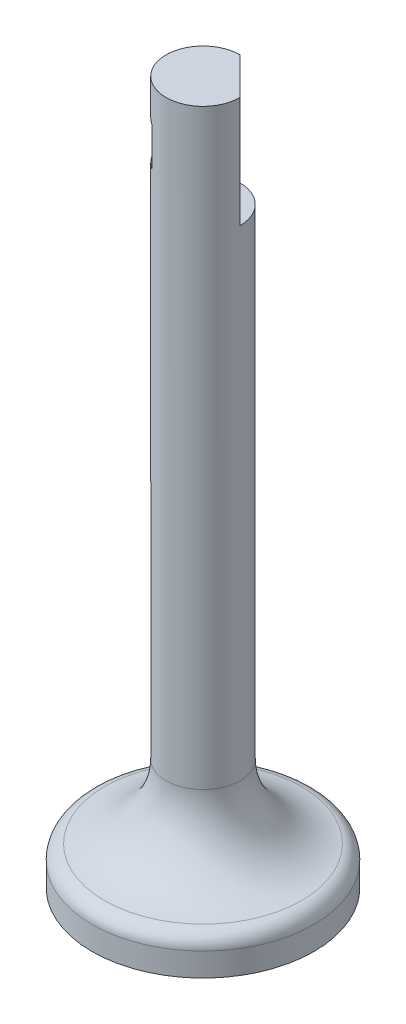
ISO-10303-21;
HEADER;
FILE_DESCRIPTION(('STEP AP214'),'2;1');
FILE_NAME('part.step','',(''),(''),'','','');
FILE_SCHEMA(('AUTOMOTIVE_DESIGN { 1 0 10303 214 1 1 1 1 }'));
ENDSEC;
DATA;
#1=APPLICATION_CONTEXT('core data for automotive mechanical design processes');
#2=APPLICATION_PROTOCOL_DEFINITION('international standard','automotive_design',2000,#1);
#3=PRODUCT_CONTEXT('',#1,'mechanical');
#4=PRODUCT('Part','Part','',(#3));
#5=PRODUCT_RELATED_PRODUCT_CATEGORY('part','',(#4));
#6=PRODUCT_DEFINITION_FORMATION('','',#4);
#7=PRODUCT_DEFINITION_CONTEXT('part definition',#1,'design');
#8=PRODUCT_DEFINITION('design','',#6,#7);
#9=PRODUCT_DEFINITION_SHAPE('','',#8);
#10=(LENGTH_UNIT() NAMED_UNIT(*) SI_UNIT(.MILLI.,.METRE.));
#11=(NAMED_UNIT(*) PLANE_ANGLE_UNIT() SI_UNIT($,.RADIAN.));
#12=(NAMED_UNIT(*) SI_UNIT($,.STERADIAN.) SOLID_ANGLE_UNIT());
#13=UNCERTAINTY_MEASURE_WITH_UNIT(LENGTH_MEASURE(1.E-05),#10,'distance_accuracy_value','');
#14=(GEOMETRIC_REPRESENTATION_CONTEXT(3) GLOBAL_UNCERTAINTY_ASSIGNED_CONTEXT((#13)) GLOBAL_UNIT_ASSIGNED_CONTEXT((#10,
#11,#12)) REPRESENTATION_CONTEXT('',''));
#15=CARTESIAN_POINT('',(0.,0.,0.));
#16=DIRECTION('',(0.,0.,1.));
#17=DIRECTION('',(1.,0.,0.));
#18=AXIS2_PLACEMENT_3D('',#15,#16,#17);
#19=CARTESIAN_POINT('',(0.,0.,0.));
#20=DIRECTION('',(0.,1.,0.));
#21=DIRECTION('',(0.,0.,1.));
#22=AXIS2_PLACEMENT_3D('',#19,#20,#21);
#23=PLANE('',#22);
#24=CARTESIAN_POINT('',(0.,0.,0.));
#25=DIRECTION('',(0.,-1.,0.));
#26=DIRECTION('',(0.,0.,-1.));
#27=AXIS2_PLACEMENT_3D('',#24,#25,#26);
#28=CIRCLE('',#27,13.5);
#29=CARTESIAN_POINT('',(0.,0.,-13.5));
#30=VERTEX_POINT('',#29);
#31=EDGE_CURVE('E259',#30,#30,#28,.T.);
#32=ORIENTED_EDGE('',*,*,#31,.F.);
#33=EDGE_LOOP('',(#32));
#34=FACE_BOUND('',#33,.T.);
#35=CARTESIAN_POINT('',(0.,0.,0.));
#36=DIRECTION('',(0.,1.,0.));
#37=DIRECTION('',(0.,0.,1.));
#38=AXIS2_PLACEMENT_3D('',#35,#36,#37);
#39=CIRCLE('',#38,15.);
#40=CARTESIAN_POINT('',(0.,0.,15.));
#41=VERTEX_POINT('',#40);
#42=EDGE_CURVE('E207',#41,#41,#39,.T.);
#43=ORIENTED_EDGE('',*,*,#42,.F.);
#44=EDGE_LOOP('',(#43));
#45=FACE_BOUND('',#44,.T.);
#46=ADVANCED_FACE('F34',(#34,#45),#23,.F.);
#47=CARTESIAN_POINT('',(0.,5.,0.));
#48=DIRECTION('',(0.,-1.,0.));
#49=DIRECTION('',(0.,0.,-1.));
#50=AXIS2_PLACEMENT_3D('',#47,#48,#49);
#51=CYLINDRICAL_SURFACE('',#50,15.);
#52=CARTESIAN_POINT('',(0.,3.16784043380077,0.));
#53=DIRECTION('',(0.,-1.,0.));
#54=DIRECTION('',(0.,0.,-1.));
#55=AXIS2_PLACEMENT_3D('',#52,#53,#54);
#56=CIRCLE('',#55,15.);
#57=CARTESIAN_POINT('',(0.,3.16784043380077,-15.));
#58=VERTEX_POINT('',#57);
#59=EDGE_CURVE('E11',#58,#58,#56,.T.);
#60=ORIENTED_EDGE('',*,*,#59,.T.);
#61=EDGE_LOOP('',(#60));
#62=FACE_BOUND('',#61,.T.);
#63=ORIENTED_EDGE('',*,*,#42,.T.);
#64=EDGE_LOOP('',(#63));
#65=FACE_BOUND('',#64,.T.);
#66=ADVANCED_FACE('F231',(#62,#65),#51,.T.);
#67=CARTESIAN_POINT('',(0.,95.,0.));
#68=DIRECTION('',(0.,-1.,0.));
#69=DIRECTION('',(0.,0.,-1.));
#70=AXIS2_PLACEMENT_3D('',#67,#68,#69);
#71=CYLINDRICAL_SURFACE('',#70,5.);
#72=CARTESIAN_POINT('',(0.,15.,0.));
#73=DIRECTION('',(0.,1.,0.));
#74=DIRECTION('',(0.,0.,1.));
#75=AXIS2_PLACEMENT_3D('',#72,#73,#74);
#76=CIRCLE('',#75,5.);
#77=CARTESIAN_POINT('',(0.,15.,5.));
#78=VERTEX_POINT('',#77);
#79=EDGE_CURVE('E210',#78,#78,#76,.T.);
#80=ORIENTED_EDGE('',*,*,#79,.T.);
#81=EDGE_LOOP('',(#80));
#82=FACE_BOUND('',#81,.T.);
#83=CARTESIAN_POINT('',(0.,90.1,0.));
#84=DIRECTION('',(0.,1.,0.));
#85=DIRECTION('',(0.,0.,1.));
#86=AXIS2_PLACEMENT_3D('',#83,#84,#85);
#87=CIRCLE('',#86,5.);
#88=CARTESIAN_POINT('',(-4.1712083963243,90.1,2.7569948339512));
#89=VERTEX_POINT('',#88);
#90=CARTESIAN_POINT('',(-2.75699483395121,90.1,4.1712083963243));
#91=VERTEX_POINT('',#90);
#92=EDGE_CURVE('E186',#89,#91,#87,.T.);
#93=ORIENTED_EDGE('',*,*,#92,.T.);
#94=DIRECTION('',(0.,-1.,0.));
#95=VECTOR('',#94,1.);
#96=CARTESIAN_POINT('',(-2.75699483395121,95.,4.1712083963243));
#97=LINE('',#96,#95);
#98=CARTESIAN_POINT('',(-2.75699483395121,84.9,4.1712083963243));
#99=VERTEX_POINT('',#98);
#100=EDGE_CURVE('E189',#91,#99,#97,.T.);
#101=ORIENTED_EDGE('',*,*,#100,.T.);
#102=CARTESIAN_POINT('',(0.,84.9,0.));
#103=DIRECTION('',(0.,-1.,0.));
#104=DIRECTION('',(0.,0.,-1.));
#105=AXIS2_PLACEMENT_3D('',#102,#103,#104);
#106=CIRCLE('',#105,5.);
#107=CARTESIAN_POINT('',(-4.1712083963243,84.9,2.75699483395121));
#108=VERTEX_POINT('',#107);
#109=EDGE_CURVE('E175',#99,#108,#106,.T.);
#110=ORIENTED_EDGE('',*,*,#109,.T.);
#111=DIRECTION('',(0.,-1.,0.));
#112=VECTOR('',#111,1.);
#113=CARTESIAN_POINT('',(-4.1712083963243,95.,2.75699483395121));
#114=LINE('',#113,#112);
#115=EDGE_CURVE('E183',#108,#89,#114,.F.);
#116=ORIENTED_EDGE('',*,*,#115,.T.);
#117=EDGE_LOOP('',(#93,#101,#110,#116));
#118=FACE_BOUND('',#117,.T.);
#119=CARTESIAN_POINT('',(0.,95.,0.));
#120=DIRECTION('',(0.,1.,0.));
#121=DIRECTION('',(0.,0.,1.));
#122=AXIS2_PLACEMENT_3D('',#119,#120,#121);
#123=CIRCLE('',#122,5.);
#124=CARTESIAN_POINT('',(0.,95.,-5.));
#125=VERTEX_POINT('',#124);
#126=CARTESIAN_POINT('',(5.,95.,0.));
#127=VERTEX_POINT('',#126);
#128=EDGE_CURVE('E203',#125,#127,#123,.T.);
#129=ORIENTED_EDGE('',*,*,#128,.F.);
#130=DIRECTION('',(0.,1.,0.));
#131=VECTOR('',#130,1.);
#132=CARTESIAN_POINT('',(0.,80.,-5.));
#133=LINE('',#132,#131);
#134=CARTESIAN_POINT('',(0.,80.,-5.));
#135=VERTEX_POINT('',#134);
#136=EDGE_CURVE('E198',#135,#125,#133,.T.);
#137=ORIENTED_EDGE('',*,*,#136,.F.);
#138=CARTESIAN_POINT('',(0.,80.,0.));
#139=DIRECTION('',(0.,1.,0.));
#140=DIRECTION('',(0.,0.,-1.));
#141=AXIS2_PLACEMENT_3D('',#138,#139,#140);
#142=CIRCLE('',#141,5.00000000000001);
#143=CARTESIAN_POINT('',(5.,80.,0.));
#144=VERTEX_POINT('',#143);
#145=EDGE_CURVE('E193',#144,#135,#142,.T.);
#146=ORIENTED_EDGE('',*,*,#145,.F.);
#147=DIRECTION('',(0.,1.,0.));
#148=VECTOR('',#147,1.);
#149=CARTESIAN_POINT('',(5.,80.,0.));
#150=LINE('',#149,#148);
#151=EDGE_CURVE('E200',#144,#127,#150,.T.);
#152=ORIENTED_EDGE('',*,*,#151,.T.);
#153=EDGE_LOOP('',(#129,#137,#146,#152));
#154=FACE_BOUND('',#153,.T.);
#155=ADVANCED_FACE('F238',(#82,#118,#154),#71,.T.);
#156=CARTESIAN_POINT('',(0.,95.,0.));
#157=DIRECTION('',(0.,1.,0.));
#158=DIRECTION('',(0.,0.,1.));
#159=AXIS2_PLACEMENT_3D('',#156,#157,#158);
#160=PLANE('',#159);
#161=DIRECTION('',(0.707106781186548,0.,0.707106781186548));
#162=VECTOR('',#161,1.);
#163=CARTESIAN_POINT('',(0.,95.,-5.));
#164=LINE('',#163,#162);
#165=EDGE_CURVE('E192',#125,#127,#164,.T.);
#166=ORIENTED_EDGE('',*,*,#165,.F.);
#167=ORIENTED_EDGE('',*,*,#128,.T.);
#168=EDGE_LOOP('',(#166,#167));
#169=FACE_BOUND('',#168,.T.);
#170=ADVANCED_FACE('F371',(#169),#160,.T.);
#171=CARTESIAN_POINT('',(0.,80.,-5.));
#172=DIRECTION('',(-0.707106781186547,0.,0.707106781186547));
#173=DIRECTION('',(0.707106781186548,0.,0.707106781186548));
#174=AXIS2_PLACEMENT_3D('',#171,#172,#173);
#175=PLANE('',#174);
#176=DIRECTION('',(-0.707106781186547,0.,-0.707106781186548));
#177=VECTOR('',#176,1.);
#178=CARTESIAN_POINT('',(1.79289321881345,84.9,-3.20710678118655));
#179=LINE('',#178,#177);
#180=CARTESIAN_POINT('',(3.20710678118655,84.9,-1.79289321881345));
#181=VERTEX_POINT('',#180);
#182=CARTESIAN_POINT('',(1.79289321881345,84.9,-3.20710678118655));
#183=VERTEX_POINT('',#182);
#184=EDGE_CURVE('E159',#181,#183,#179,.T.);
#185=ORIENTED_EDGE('',*,*,#184,.F.);
#186=DIRECTION('',(0.,-1.,0.));
#187=VECTOR('',#186,1.);
#188=CARTESIAN_POINT('',(3.20710678118655,90.1,-1.79289321881345));
#189=LINE('',#188,#187);
#190=CARTESIAN_POINT('',(3.20710678118655,90.1,-1.79289321881345));
#191=VERTEX_POINT('',#190);
#192=EDGE_CURVE('E156',#191,#181,#189,.T.);
#193=ORIENTED_EDGE('',*,*,#192,.F.);
#194=DIRECTION('',(0.707106781186547,0.,0.707106781186548));
#195=VECTOR('',#194,1.);
#196=CARTESIAN_POINT('',(1.79289321881345,90.1,-3.20710678118655));
#197=LINE('',#196,#195);
#198=CARTESIAN_POINT('',(1.79289321881345,90.1,-3.20710678118655));
#199=VERTEX_POINT('',#198);
#200=EDGE_CURVE('E169',#199,#191,#197,.T.);
#201=ORIENTED_EDGE('',*,*,#200,.F.);
#202=DIRECTION('',(0.,1.,0.));
#203=VECTOR('',#202,1.);
#204=CARTESIAN_POINT('',(1.79289321881345,90.1,-3.20710678118655));
#205=LINE('',#204,#203);
#206=EDGE_CURVE('E166',#183,#199,#205,.T.);
#207=ORIENTED_EDGE('',*,*,#206,.F.);
#208=EDGE_LOOP('',(#185,#193,#201,#207));
#209=FACE_BOUND('',#208,.T.);
#210=ORIENTED_EDGE('',*,*,#165,.T.);
#211=ORIENTED_EDGE('',*,*,#151,.F.);
#212=DIRECTION('',(0.707106781186548,0.,0.707106781186548));
#213=VECTOR('',#212,1.);
#214=CARTESIAN_POINT('',(0.,80.,-5.));
#215=LINE('',#214,#213);
#216=EDGE_CURVE('E195',#135,#144,#215,.T.);
#217=ORIENTED_EDGE('',*,*,#216,.F.);
#218=ORIENTED_EDGE('',*,*,#136,.T.);
#219=EDGE_LOOP('',(#210,#211,#217,#218));
#220=FACE_BOUND('',#219,.T.);
#221=ADVANCED_FACE('F367',(#209,#220),#175,.F.);
#222=CARTESIAN_POINT('',(0.,80.,0.));
#223=DIRECTION('',(0.,-1.,0.));
#224=DIRECTION('',(0.,0.,-1.));
#225=AXIS2_PLACEMENT_3D('',#222,#223,#224);
#226=PLANE('',#225);
#227=ORIENTED_EDGE('',*,*,#145,.T.);
#228=ORIENTED_EDGE('',*,*,#216,.T.);
#229=EDGE_LOOP('',(#227,#228));
#230=FACE_BOUND('',#229,.T.);
#231=ADVANCED_FACE('F363',(#230),#226,.F.);
#232=CARTESIAN_POINT('',(-14.2928932188135,90.1,15.7071067811865));
#233=DIRECTION('',(0.707106781186548,0.,0.707106781186548));
#234=DIRECTION('',(0.707106781186548,0.,-0.707106781186547));
#235=AXIS2_PLACEMENT_3D('',#232,#233,#234);
#236=PLANE('',#235);
#237=DIRECTION('',(0.707106781186548,0.,-0.707106781186548));
#238=VECTOR('',#237,1.);
#239=CARTESIAN_POINT('',(-14.2928932188135,90.1,15.7071067811865));
#240=LINE('',#239,#238);
#241=EDGE_CURVE('E173',#91,#191,#240,.T.);
#242=ORIENTED_EDGE('',*,*,#241,.T.);
#243=ORIENTED_EDGE('',*,*,#192,.T.);
#244=DIRECTION('',(0.707106781186548,0.,-0.707106781186548));
#245=VECTOR('',#244,1.);
#246=CARTESIAN_POINT('',(-14.2928932188135,84.9,15.7071067811865));
#247=LINE('',#246,#245);
#248=EDGE_CURVE('E172',#99,#181,#247,.T.);
#249=ORIENTED_EDGE('',*,*,#248,.F.);
#250=ORIENTED_EDGE('',*,*,#100,.F.);
#251=EDGE_LOOP('',(#242,#243,#249,#250));
#252=FACE_BOUND('',#251,.T.);
#253=ADVANCED_FACE('F354',(#252),#236,.F.);
#254=CARTESIAN_POINT('',(-15.7071067811866,90.1,14.2928932188135));
#255=DIRECTION('',(0.,1.,0.));
#256=DIRECTION('',(0.,0.,1.));
#257=AXIS2_PLACEMENT_3D('',#254,#255,#256);
#258=PLANE('',#257);
#259=DIRECTION('',(0.707106781186548,0.,-0.707106781186548));
#260=VECTOR('',#259,1.);
#261=CARTESIAN_POINT('',(-15.7071067811866,90.1,14.2928932188135));
#262=LINE('',#261,#260);
#263=EDGE_CURVE('E176',#89,#199,#262,.T.);
#264=ORIENTED_EDGE('',*,*,#263,.T.);
#265=ORIENTED_EDGE('',*,*,#200,.T.);
#266=ORIENTED_EDGE('',*,*,#241,.F.);
#267=ORIENTED_EDGE('',*,*,#92,.F.);
#268=EDGE_LOOP('',(#264,#265,#266,#267));
#269=FACE_BOUND('',#268,.T.);
#270=ADVANCED_FACE('F350',(#269),#258,.F.);
#271=CARTESIAN_POINT('',(-15.7071067811866,90.1,14.2928932188135));
#272=DIRECTION('',(-0.707106781186548,0.,-0.707106781186548));
#273=DIRECTION('',(-0.707106781186548,0.,0.707106781186547));
#274=AXIS2_PLACEMENT_3D('',#271,#272,#273);
#275=PLANE('',#274);
#276=DIRECTION('',(0.707106781186548,0.,-0.707106781186548));
#277=VECTOR('',#276,1.);
#278=CARTESIAN_POINT('',(-15.7071067811866,84.9,14.2928932188135));
#279=LINE('',#278,#277);
#280=EDGE_CURVE('E57',#108,#183,#279,.T.);
#281=ORIENTED_EDGE('',*,*,#280,.T.);
#282=ORIENTED_EDGE('',*,*,#206,.T.);
#283=ORIENTED_EDGE('',*,*,#263,.F.);
#284=ORIENTED_EDGE('',*,*,#115,.F.);
#285=EDGE_LOOP('',(#281,#282,#283,#284));
#286=FACE_BOUND('',#285,.T.);
#287=ADVANCED_FACE('F353',(#286),#275,.F.);
#288=CARTESIAN_POINT('',(-15.7071067811866,84.9,14.2928932188135));
#289=DIRECTION('',(0.,-1.,0.));
#290=DIRECTION('',(0.,0.,-1.));
#291=AXIS2_PLACEMENT_3D('',#288,#289,#290);
#292=PLANE('',#291);
#293=ORIENTED_EDGE('',*,*,#248,.T.);
#294=ORIENTED_EDGE('',*,*,#184,.T.);
#295=ORIENTED_EDGE('',*,*,#280,.F.);
#296=ORIENTED_EDGE('',*,*,#109,.F.);
#297=EDGE_LOOP('',(#293,#294,#295,#296));
#298=FACE_BOUND('',#297,.T.);
#299=ADVANCED_FACE('F228',(#298),#292,.F.);
#300=CARTESIAN_POINT('',(0.,15.,0.));
#301=DIRECTION('',(0.,1.,0.));
#302=DIRECTION('',(0.,0.,1.));
#303=AXIS2_PLACEMENT_3D('',#300,#301,#302);
#304=TOROIDAL_SURFACE('',#303,15.,10.);
#305=CARTESIAN_POINT('',(0.,5.13986702816722,0.));
#306=DIRECTION('',(0.,1.,0.));
#307=DIRECTION('',(0.,0.,1.));
#308=AXIS2_PLACEMENT_3D('',#305,#306,#307);
#309=CIRCLE('',#308,13.3333333333333);
#310=CARTESIAN_POINT('',(0.,5.13986702816722,13.3333333333333));
#311=VERTEX_POINT('',#310);
#312=EDGE_CURVE('E42',#311,#311,#309,.T.);
#313=ORIENTED_EDGE('',*,*,#312,.T.);
#314=EDGE_LOOP('',(#313));
#315=FACE_BOUND('',#314,.T.);
#316=ORIENTED_EDGE('',*,*,#79,.F.);
#317=EDGE_LOOP('',(#316));
#318=FACE_BOUND('',#317,.T.);
#319=ADVANCED_FACE('F215',(#315,#318),#304,.F.);
#320=CARTESIAN_POINT('',(0.,3.16784043380077,0.));
#321=DIRECTION('',(0.,-1.,0.));
#322=DIRECTION('',(0.,0.,-1.));
#323=AXIS2_PLACEMENT_3D('',#320,#321,#322);
#324=TOROIDAL_SURFACE('',#323,13.,2.);
#325=ORIENTED_EDGE('',*,*,#59,.F.);
#326=EDGE_LOOP('',(#325));
#327=FACE_BOUND('',#326,.T.);
#328=ORIENTED_EDGE('',*,*,#312,.F.);
#329=EDGE_LOOP('',(#328));
#330=FACE_BOUND('',#329,.T.);
#331=ADVANCED_FACE('F36',(#327,#330),#324,.T.);
#332=CARTESIAN_POINT('',(0.,1.,0.));
#333=DIRECTION('',(0.,-1.,0.));
#334=DIRECTION('',(0.,0.,-1.));
#335=AXIS2_PLACEMENT_3D('',#332,#333,#334);
#336=CYLINDRICAL_SURFACE('',#335,13.5);
#337=CARTESIAN_POINT('',(0.,1.,0.));
#338=DIRECTION('',(0.,-1.,0.));
#339=DIRECTION('',(0.,0.,-1.));
#340=AXIS2_PLACEMENT_3D('',#337,#338,#339);
#341=CIRCLE('',#340,13.5);
#342=CARTESIAN_POINT('',(0.,1.,-13.5));
#343=VERTEX_POINT('',#342);
#344=EDGE_CURVE('E262',#343,#343,#341,.T.);
#345=ORIENTED_EDGE('',*,*,#344,.F.);
#346=EDGE_LOOP('',(#345));
#347=FACE_BOUND('',#346,.T.);
#348=ORIENTED_EDGE('',*,*,#31,.T.);
#349=EDGE_LOOP('',(#348));
#350=FACE_BOUND('',#349,.T.);
#351=ADVANCED_FACE('F219',(#347,#350),#336,.F.);
#352=CARTESIAN_POINT('',(0.,1.,0.));
#353=DIRECTION('',(0.,-1.,0.));
#354=DIRECTION('',(0.,0.,-1.));
#355=AXIS2_PLACEMENT_3D('',#352,#353,#354);
#356=PLANE('',#355);
#357=CARTESIAN_POINT('',(0.,1.,0.));
#358=DIRECTION('',(0.,-1.,0.));
#359=DIRECTION('',(0.,0.,-1.));
#360=AXIS2_PLACEMENT_3D('',#357,#358,#359);
#361=CIRCLE('',#360,11.5);
#362=CARTESIAN_POINT('',(0.,1.,-11.5));
#363=VERTEX_POINT('',#362);
#364=EDGE_CURVE('E256',#363,#363,#361,.T.);
#365=ORIENTED_EDGE('',*,*,#364,.F.);
#366=EDGE_LOOP('',(#365));
#367=FACE_BOUND('',#366,.T.);
#368=ORIENTED_EDGE('',*,*,#344,.T.);
#369=EDGE_LOOP('',(#368));
#370=FACE_BOUND('',#369,.T.);
#371=ADVANCED_FACE('F225',(#367,#370),#356,.T.);
#372=CARTESIAN_POINT('',(0.,1.,0.));
#373=DIRECTION('',(0.,-1.,0.));
#374=DIRECTION('',(0.,0.,-1.));
#375=AXIS2_PLACEMENT_3D('',#372,#373,#374);
#376=CYLINDRICAL_SURFACE('',#375,11.5);
#377=ORIENTED_EDGE('',*,*,#364,.T.);
#378=EDGE_LOOP('',(#377));
#379=FACE_BOUND('',#378,.T.);
#380=CARTESIAN_POINT('',(0.,0.,0.));
#381=DIRECTION('',(0.,-1.,0.));
#382=DIRECTION('',(0.,0.,-1.));
#383=AXIS2_PLACEMENT_3D('',#380,#381,#382);
#384=CIRCLE('',#383,11.5);
#385=CARTESIAN_POINT('',(0.,0.,-11.5));
#386=VERTEX_POINT('',#385);
#387=EDGE_CURVE('E254',#386,#386,#384,.T.);
#388=ORIENTED_EDGE('',*,*,#387,.F.);
#389=EDGE_LOOP('',(#388));
#390=FACE_BOUND('',#389,.T.);
#391=ADVANCED_FACE('F337',(#379,#390),#376,.T.);
#392=CARTESIAN_POINT('',(0.,1.,0.));
#393=DIRECTION('',(0.,1.,0.));
#394=DIRECTION('',(0.,0.,1.));
#395=AXIS2_PLACEMENT_3D('',#392,#393,#394);
#396=PLANE('',#395);
#397=DIRECTION('',(0.707106781186548,0.,0.707106781186548));
#398=VECTOR('',#397,1.);
#399=CARTESIAN_POINT('',(-7.0240990471406,1.,5.70382301421725));
#400=LINE('',#399,#398);
#401=CARTESIAN_POINT('',(-7.0240990471406,1.,5.70382301421725));
#402=VERTEX_POINT('',#401);
#403=CARTESIAN_POINT('',(-5.5465349445765,1.,7.18138711678135));
#404=VERTEX_POINT('',#403);
#405=EDGE_CURVE('E141',#402,#404,#400,.T.);
#406=ORIENTED_EDGE('',*,*,#405,.F.);
#407=DIRECTION('',(-0.707106781186547,0.,0.707106781186547));
#408=VECTOR('',#407,1.);
#409=CARTESIAN_POINT('',(2.81884967080811,1.,-4.13912570373147));
#410=LINE('',#409,#408);
#411=CARTESIAN_POINT('',(2.81884967080811,1.,-4.13912570373147));
#412=VERTEX_POINT('',#411);
#413=EDGE_CURVE('E276',#412,#402,#410,.T.);
#414=ORIENTED_EDGE('',*,*,#413,.F.);
#415=DIRECTION('',(0.707106781186547,0.,0.707106781186547));
#416=VECTOR('',#415,1.);
#417=CARTESIAN_POINT('',(-0.873458021499578,1.,-7.83143339603916));
#418=LINE('',#417,#416);
#419=CARTESIAN_POINT('',(-0.873458021499578,1.,-7.83143339603916));
#420=VERTEX_POINT('',#419);
#421=EDGE_CURVE('E274',#420,#412,#418,.T.);
#422=ORIENTED_EDGE('',*,*,#421,.F.);
#423=DIRECTION('',(-0.707106781186547,0.,0.707106781186548));
#424=VECTOR('',#423,1.);
#425=CARTESIAN_POINT('',(0.443849670808114,1.,-9.14874108834685));
#426=LINE('',#425,#424);
#427=CARTESIAN_POINT('',(0.443849670808114,1.,-9.14874108834685));
#428=VERTEX_POINT('',#427);
#429=EDGE_CURVE('E272',#428,#420,#426,.T.);
#430=ORIENTED_EDGE('',*,*,#429,.F.);
#431=DIRECTION('',(-0.707106781186548,0.,-0.707106781186548));
#432=VECTOR('',#431,1.);
#433=CARTESIAN_POINT('',(9.29000351696196,1.,-0.302587242193005));
#434=LINE('',#433,#432);
#435=CARTESIAN_POINT('',(9.29000351696196,1.,-0.302587242193005));
#436=VERTEX_POINT('',#435);
#437=EDGE_CURVE('E270',#436,#428,#434,.T.);
#438=ORIENTED_EDGE('',*,*,#437,.F.);
#439=DIRECTION('',(0.707106781186548,0.,-0.707106781186548));
#440=VECTOR('',#439,1.);
#441=CARTESIAN_POINT('',(7.97269582465427,1.,1.01472045011469));
#442=LINE('',#441,#440);
#443=CARTESIAN_POINT('',(7.97269582465427,1.,1.01472045011469));
#444=VERTEX_POINT('',#443);
#445=EDGE_CURVE('E268',#444,#436,#442,.T.);
#446=ORIENTED_EDGE('',*,*,#445,.F.);
#447=DIRECTION('',(0.707106781186547,0.,0.707106781186547));
#448=VECTOR('',#447,1.);
#449=CARTESIAN_POINT('',(4.29641377337222,1.,-2.66156160116736));
#450=LINE('',#449,#448);
#451=CARTESIAN_POINT('',(4.29641377337222,1.,-2.66156160116736));
#452=VERTEX_POINT('',#451);
#453=EDGE_CURVE('E143',#452,#444,#450,.T.);
#454=ORIENTED_EDGE('',*,*,#453,.F.);
#455=DIRECTION('',(0.707106781186548,0.,-0.707106781186547));
#456=VECTOR('',#455,1.);
#457=CARTESIAN_POINT('',(-5.5465349445765,1.,7.18138711678135));
#458=LINE('',#457,#456);
#459=EDGE_CURVE('E137',#404,#452,#458,.T.);
#460=ORIENTED_EDGE('',*,*,#459,.F.);
#461=EDGE_LOOP('',(#406,#414,#422,#430,#438,#446,#454,#460));
#462=FACE_BOUND('',#461,.T.);
#463=ADVANCED_FACE('F139',(#462),#396,.F.);
#464=CARTESIAN_POINT('',(2.81884967080811,1.,-4.13912570373147));
#465=DIRECTION('',(0.707106781186547,0.,0.707106781186547));
#466=DIRECTION('',(0.707106781186548,0.,-0.707106781186548));
#467=AXIS2_PLACEMENT_3D('',#464,#465,#466);
#468=PLANE('',#467);
#469=DIRECTION('',(-0.707106781186547,0.,0.707106781186547));
#470=VECTOR('',#469,1.);
#471=CARTESIAN_POINT('',(2.81884967080811,0.,-4.13912570373147));
#472=LINE('',#471,#470);
#473=CARTESIAN_POINT('',(2.81884967080811,0.,-4.13912570373147));
#474=VERTEX_POINT('',#473);
#475=CARTESIAN_POINT('',(-7.0240990471406,0.,5.70382301421725));
#476=VERTEX_POINT('',#475);
#477=EDGE_CURVE('E151',#474,#476,#472,.T.);
#478=ORIENTED_EDGE('',*,*,#477,.F.);
#479=DIRECTION('',(0.,-1.,0.));
#480=VECTOR('',#479,1.);
#481=CARTESIAN_POINT('',(2.81884967080811,1.,-4.13912570373147));
#482=LINE('',#481,#480);
#483=EDGE_CURVE('E297',#412,#474,#482,.T.);
#484=ORIENTED_EDGE('',*,*,#483,.F.);
#485=ORIENTED_EDGE('',*,*,#413,.T.);
#486=DIRECTION('',(0.,-1.,0.));
#487=VECTOR('',#486,1.);
#488=CARTESIAN_POINT('',(-7.0240990471406,1.,5.70382301421725));
#489=LINE('',#488,#487);
#490=EDGE_CURVE('E150',#402,#476,#489,.T.);
#491=ORIENTED_EDGE('',*,*,#490,.T.);
#492=EDGE_LOOP('',(#478,#484,#485,#491));
#493=FACE_BOUND('',#492,.T.);
#494=ADVANCED_FACE('F329',(#493),#468,.T.);
#495=CARTESIAN_POINT('',(-0.873458021499578,1.,-7.83143339603916));
#496=DIRECTION('',(0.707106781186547,0.,-0.707106781186547));
#497=DIRECTION('',(-0.707106781186548,0.,-0.707106781186548));
#498=AXIS2_PLACEMENT_3D('',#495,#496,#497);
#499=PLANE('',#498);
#500=DIRECTION('',(0.707106781186547,0.,0.707106781186547));
#501=VECTOR('',#500,1.);
#502=CARTESIAN_POINT('',(-0.873458021499578,0.,-7.83143339603916));
#503=LINE('',#502,#501);
#504=CARTESIAN_POINT('',(-0.873458021499578,0.,-7.83143339603916));
#505=VERTEX_POINT('',#504);
#506=EDGE_CURVE('E292',#505,#474,#503,.T.);
#507=ORIENTED_EDGE('',*,*,#506,.F.);
#508=DIRECTION('',(0.,-1.,0.));
#509=VECTOR('',#508,1.);
#510=CARTESIAN_POINT('',(-0.873458021499578,1.,-7.83143339603916));
#511=LINE('',#510,#509);
#512=EDGE_CURVE('E299',#420,#505,#511,.T.);
#513=ORIENTED_EDGE('',*,*,#512,.F.);
#514=ORIENTED_EDGE('',*,*,#421,.T.);
#515=ORIENTED_EDGE('',*,*,#483,.T.);
#516=EDGE_LOOP('',(#507,#513,#514,#515));
#517=FACE_BOUND('',#516,.T.);
#518=ADVANCED_FACE('F325',(#517),#499,.T.);
#519=CARTESIAN_POINT('',(0.443849670808114,1.,-9.14874108834685));
#520=DIRECTION('',(0.707106781186548,0.,0.707106781186547));
#521=DIRECTION('',(0.707106781186547,0.,-0.707106781186548));
#522=AXIS2_PLACEMENT_3D('',#519,#520,#521);
#523=PLANE('',#522);
#524=DIRECTION('',(-0.707106781186547,0.,0.707106781186548));
#525=VECTOR('',#524,1.);
#526=CARTESIAN_POINT('',(0.443849670808114,0.,-9.14874108834685));
#527=LINE('',#526,#525);
#528=CARTESIAN_POINT('',(0.443849670808114,0.,-9.14874108834685));
#529=VERTEX_POINT('',#528);
#530=EDGE_CURVE('E289',#529,#505,#527,.T.);
#531=ORIENTED_EDGE('',*,*,#530,.F.);
#532=DIRECTION('',(0.,-1.,0.));
#533=VECTOR('',#532,1.);
#534=CARTESIAN_POINT('',(0.443849670808114,1.,-9.14874108834685));
#535=LINE('',#534,#533);
#536=EDGE_CURVE('E301',#428,#529,#535,.T.);
#537=ORIENTED_EDGE('',*,*,#536,.F.);
#538=ORIENTED_EDGE('',*,*,#429,.T.);
#539=ORIENTED_EDGE('',*,*,#512,.T.);
#540=EDGE_LOOP('',(#531,#537,#538,#539));
#541=FACE_BOUND('',#540,.T.);
#542=ADVANCED_FACE('F320',(#541),#523,.T.);
#543=CARTESIAN_POINT('',(9.29000351696196,1.,-0.302587242193005));
#544=DIRECTION('',(-0.707106781186547,0.,0.707106781186547));
#545=DIRECTION('',(0.707106781186548,0.,0.707106781186548));
#546=AXIS2_PLACEMENT_3D('',#543,#544,#545);
#547=PLANE('',#546);
#548=DIRECTION('',(-0.707106781186548,0.,-0.707106781186548));
#549=VECTOR('',#548,1.);
#550=CARTESIAN_POINT('',(9.29000351696196,0.,-0.302587242193005));
#551=LINE('',#550,#549);
#552=CARTESIAN_POINT('',(9.29000351696196,0.,-0.302587242193005));
#553=VERTEX_POINT('',#552);
#554=EDGE_CURVE('E286',#553,#529,#551,.T.);
#555=ORIENTED_EDGE('',*,*,#554,.F.);
#556=DIRECTION('',(0.,-1.,0.));
#557=VECTOR('',#556,1.);
#558=CARTESIAN_POINT('',(9.29000351696196,1.,-0.302587242193005));
#559=LINE('',#558,#557);
#560=EDGE_CURVE('E303',#436,#553,#559,.T.);
#561=ORIENTED_EDGE('',*,*,#560,.F.);
#562=ORIENTED_EDGE('',*,*,#437,.T.);
#563=ORIENTED_EDGE('',*,*,#536,.T.);
#564=EDGE_LOOP('',(#555,#561,#562,#563));
#565=FACE_BOUND('',#564,.T.);
#566=ADVANCED_FACE('F315',(#565),#547,.T.);
#567=CARTESIAN_POINT('',(7.97269582465427,1.,1.01472045011469));
#568=DIRECTION('',(-0.707106781186547,0.,-0.707106781186547));
#569=DIRECTION('',(-0.707106781186548,0.,0.707106781186548));
#570=AXIS2_PLACEMENT_3D('',#567,#568,#569);
#571=PLANE('',#570);
#572=DIRECTION('',(0.707106781186548,0.,-0.707106781186548));
#573=VECTOR('',#572,1.);
#574=CARTESIAN_POINT('',(7.97269582465427,0.,1.01472045011469));
#575=LINE('',#574,#573);
#576=CARTESIAN_POINT('',(7.97269582465427,0.,1.01472045011469));
#577=VERTEX_POINT('',#576);
#578=EDGE_CURVE('E283',#577,#553,#575,.T.);
#579=ORIENTED_EDGE('',*,*,#578,.F.);
#580=DIRECTION('',(0.,-1.,0.));
#581=VECTOR('',#580,1.);
#582=CARTESIAN_POINT('',(7.97269582465427,1.,1.01472045011469));
#583=LINE('',#582,#581);
#584=EDGE_CURVE('E161',#444,#577,#583,.T.);
#585=ORIENTED_EDGE('',*,*,#584,.F.);
#586=ORIENTED_EDGE('',*,*,#445,.T.);
#587=ORIENTED_EDGE('',*,*,#560,.T.);
#588=EDGE_LOOP('',(#579,#585,#586,#587));
#589=FACE_BOUND('',#588,.T.);
#590=ADVANCED_FACE('F310',(#589),#571,.T.);
#591=CARTESIAN_POINT('',(4.29641377337222,1.,-2.66156160116736));
#592=DIRECTION('',(0.707106781186547,0.,-0.707106781186547));
#593=DIRECTION('',(-0.707106781186548,0.,-0.707106781186548));
#594=AXIS2_PLACEMENT_3D('',#591,#592,#593);
#595=PLANE('',#594);
#596=DIRECTION('',(0.707106781186547,0.,0.707106781186547));
#597=VECTOR('',#596,1.);
#598=CARTESIAN_POINT('',(4.29641377337222,0.,-2.66156160116736));
#599=LINE('',#598,#597);
#600=CARTESIAN_POINT('',(4.29641377337222,0.,-2.66156160116736));
#601=VERTEX_POINT('',#600);
#602=EDGE_CURVE('E280',#601,#577,#599,.T.);
#603=ORIENTED_EDGE('',*,*,#602,.F.);
#604=DIRECTION('',(0.,-1.,0.));
#605=VECTOR('',#604,1.);
#606=CARTESIAN_POINT('',(4.29641377337222,1.,-2.66156160116736));
#607=LINE('',#606,#605);
#608=EDGE_CURVE('E157',#452,#601,#607,.T.);
#609=ORIENTED_EDGE('',*,*,#608,.F.);
#610=ORIENTED_EDGE('',*,*,#453,.T.);
#611=ORIENTED_EDGE('',*,*,#584,.T.);
#612=EDGE_LOOP('',(#603,#609,#610,#611));
#613=FACE_BOUND('',#612,.T.);
#614=ADVANCED_FACE('F308',(#613),#595,.T.);
#615=CARTESIAN_POINT('',(-5.5465349445765,1.,7.18138711678135));
#616=DIRECTION('',(-0.707106781186547,0.,-0.707106781186548));
#617=DIRECTION('',(-0.707106781186548,0.,0.707106781186547));
#618=AXIS2_PLACEMENT_3D('',#615,#616,#617);
#619=PLANE('',#618);
#620=DIRECTION('',(0.707106781186548,0.,-0.707106781186547));
#621=VECTOR('',#620,1.);
#622=CARTESIAN_POINT('',(-5.5465349445765,0.,7.18138711678135));
#623=LINE('',#622,#621);
#624=CARTESIAN_POINT('',(-5.5465349445765,0.,7.18138711678135));
#625=VERTEX_POINT('',#624);
#626=EDGE_CURVE('E155',#625,#601,#623,.T.);
#627=ORIENTED_EDGE('',*,*,#626,.F.);
#628=DIRECTION('',(0.,-1.,0.));
#629=VECTOR('',#628,1.);
#630=CARTESIAN_POINT('',(-5.5465349445765,1.,7.18138711678135));
#631=LINE('',#630,#629);
#632=EDGE_CURVE('E149',#404,#625,#631,.T.);
#633=ORIENTED_EDGE('',*,*,#632,.F.);
#634=ORIENTED_EDGE('',*,*,#459,.T.);
#635=ORIENTED_EDGE('',*,*,#608,.T.);
#636=EDGE_LOOP('',(#627,#633,#634,#635));
#637=FACE_BOUND('',#636,.T.);
#638=ADVANCED_FACE('F153',(#637),#619,.T.);
#639=CARTESIAN_POINT('',(-7.0240990471406,1.,5.70382301421725));
#640=DIRECTION('',(0.707106781186547,0.,-0.707106781186547));
#641=DIRECTION('',(-0.707106781186548,0.,-0.707106781186548));
#642=AXIS2_PLACEMENT_3D('',#639,#640,#641);
#643=PLANE('',#642);
#644=DIRECTION('',(0.707106781186548,0.,0.707106781186548));
#645=VECTOR('',#644,1.);
#646=CARTESIAN_POINT('',(-7.0240990471406,0.,5.70382301421725));
#647=LINE('',#646,#645);
#648=EDGE_CURVE('E49',#476,#625,#647,.T.);
#649=ORIENTED_EDGE('',*,*,#648,.F.);
#650=ORIENTED_EDGE('',*,*,#490,.F.);
#651=ORIENTED_EDGE('',*,*,#405,.T.);
#652=ORIENTED_EDGE('',*,*,#632,.T.);
#653=EDGE_LOOP('',(#649,#650,#651,#652));
#654=FACE_BOUND('',#653,.T.);
#655=ADVANCED_FACE('F148',(#654),#643,.T.);
#656=ORIENTED_EDGE('',*,*,#648,.T.);
#657=ORIENTED_EDGE('',*,*,#626,.T.);
#658=ORIENTED_EDGE('',*,*,#602,.T.);
#659=ORIENTED_EDGE('',*,*,#578,.T.);
#660=ORIENTED_EDGE('',*,*,#554,.T.);
#661=ORIENTED_EDGE('',*,*,#530,.T.);
#662=ORIENTED_EDGE('',*,*,#506,.T.);
#663=ORIENTED_EDGE('',*,*,#477,.T.);
#664=EDGE_LOOP('',(#656,#657,#658,#659,#660,#661,#662,#663));
#665=FACE_BOUND('',#664,.T.);
#666=ORIENTED_EDGE('',*,*,#387,.T.);
#667=EDGE_LOOP('',(#666));
#668=FACE_BOUND('',#667,.T.);
#669=ADVANCED_FACE('F234',(#665,#668),#23,.F.);
#670=CLOSED_SHELL('',(#46,#66,#155,#170,#221,#231,#253,#270,#287,#299,#319,#331,#351,#371,#391,
#463,#494,#518,#542,#566,#590,#614,#638,#655,#669));
#671=MANIFOLD_SOLID_BREP('B2',#670);
#672=ADVANCED_BREP_SHAPE_REPRESENTATION('',(#18,#671),#14);
#673=SHAPE_DEFINITION_REPRESENTATION(#9,#672);
ENDSEC;
END-ISO-10303-21;
